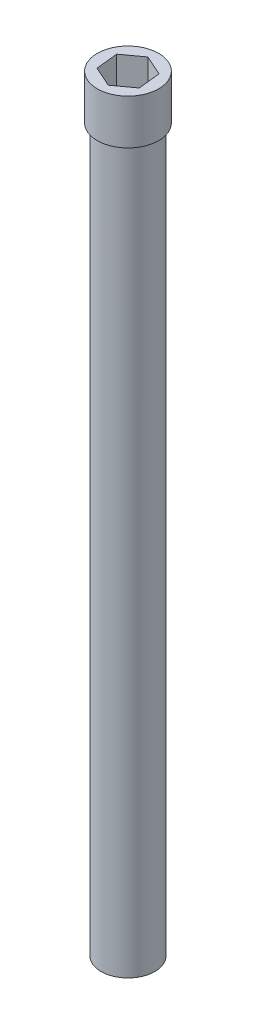
ISO-10303-21;
HEADER;
FILE_DESCRIPTION(('STEP AP214'),'2;1');
FILE_NAME('part.step','',(''),(''),'','','');
FILE_SCHEMA(('AUTOMOTIVE_DESIGN { 1 0 10303 214 1 1 1 1 }'));
ENDSEC;
DATA;
#1=APPLICATION_CONTEXT('core data for automotive mechanical design processes');
#2=APPLICATION_PROTOCOL_DEFINITION('international standard','automotive_design',2000,#1);
#3=PRODUCT_CONTEXT('',#1,'mechanical');
#4=PRODUCT('Part','Part','',(#3));
#5=PRODUCT_RELATED_PRODUCT_CATEGORY('part','',(#4));
#6=PRODUCT_DEFINITION_FORMATION('','',#4);
#7=PRODUCT_DEFINITION_CONTEXT('part definition',#1,'design');
#8=PRODUCT_DEFINITION('design','',#6,#7);
#9=PRODUCT_DEFINITION_SHAPE('','',#8);
#10=(LENGTH_UNIT() NAMED_UNIT(*) SI_UNIT(.MILLI.,.METRE.));
#11=(NAMED_UNIT(*) PLANE_ANGLE_UNIT() SI_UNIT($,.RADIAN.));
#12=(NAMED_UNIT(*) SI_UNIT($,.STERADIAN.) SOLID_ANGLE_UNIT());
#13=UNCERTAINTY_MEASURE_WITH_UNIT(LENGTH_MEASURE(1.E-05),#10,'distance_accuracy_value','');
#14=(GEOMETRIC_REPRESENTATION_CONTEXT(3) GLOBAL_UNCERTAINTY_ASSIGNED_CONTEXT((#13)) GLOBAL_UNIT_ASSIGNED_CONTEXT((#10,
#11,#12)) REPRESENTATION_CONTEXT('',''));
#15=CARTESIAN_POINT('',(0.,0.,0.));
#16=DIRECTION('',(0.,0.,1.));
#17=DIRECTION('',(1.,0.,0.));
#18=AXIS2_PLACEMENT_3D('',#15,#16,#17);
#19=CARTESIAN_POINT('',(0.,30.,0.));
#20=DIRECTION('',(0.,-1.,0.));
#21=DIRECTION('',(0.,0.,-1.));
#22=AXIS2_PLACEMENT_3D('',#19,#20,#21);
#23=CYLINDRICAL_SURFACE('',#22,3.);
#24=CARTESIAN_POINT('',(0.,30.,0.));
#25=DIRECTION('',(0.,1.,0.));
#26=DIRECTION('',(0.,0.,1.));
#27=AXIS2_PLACEMENT_3D('',#24,#25,#26);
#28=CIRCLE('',#27,3.);
#29=CARTESIAN_POINT('',(0.,30.,3.));
#30=VERTEX_POINT('',#29);
#31=EDGE_CURVE('E11',#30,#30,#28,.T.);
#32=ORIENTED_EDGE('',*,*,#31,.F.);
#33=EDGE_LOOP('',(#32));
#34=FACE_BOUND('',#33,.T.);
#35=CARTESIAN_POINT('',(0.,-50.3608413131586,0.));
#36=DIRECTION('',(0.,-1.,0.));
#37=DIRECTION('',(0.,0.,-1.));
#38=AXIS2_PLACEMENT_3D('',#35,#36,#37);
#39=CIRCLE('',#38,3.);
#40=CARTESIAN_POINT('',(0.,-50.3608413131586,-3.));
#41=VERTEX_POINT('',#40);
#42=EDGE_CURVE('E126',#41,#41,#39,.T.);
#43=ORIENTED_EDGE('',*,*,#42,.F.);
#44=EDGE_LOOP('',(#43));
#45=FACE_BOUND('',#44,.T.);
#46=ADVANCED_FACE('F37',(#34,#45),#23,.T.);
#47=CARTESIAN_POINT('',(0.,35.,0.));
#48=DIRECTION('',(0.,-1.,0.));
#49=DIRECTION('',(0.,0.,-1.));
#50=AXIS2_PLACEMENT_3D('',#47,#48,#49);
#51=CYLINDRICAL_SURFACE('',#50,3.42046218774851);
#52=CARTESIAN_POINT('',(0.,35.,0.));
#53=DIRECTION('',(0.,1.,0.));
#54=DIRECTION('',(0.,0.,1.));
#55=AXIS2_PLACEMENT_3D('',#52,#53,#54);
#56=CIRCLE('',#55,3.42046218774851);
#57=CARTESIAN_POINT('',(0.,35.,3.42046218774851));
#58=VERTEX_POINT('',#57);
#59=EDGE_CURVE('E44',#58,#58,#56,.T.);
#60=ORIENTED_EDGE('',*,*,#59,.F.);
#61=EDGE_LOOP('',(#60));
#62=FACE_BOUND('',#61,.T.);
#63=CARTESIAN_POINT('',(0.,30.,0.));
#64=DIRECTION('',(0.,1.,0.));
#65=DIRECTION('',(0.,0.,1.));
#66=AXIS2_PLACEMENT_3D('',#63,#64,#65);
#67=CIRCLE('',#66,3.42046218774851);
#68=CARTESIAN_POINT('',(0.,30.,3.42046218774851));
#69=VERTEX_POINT('',#68);
#70=EDGE_CURVE('E139',#69,#69,#67,.T.);
#71=ORIENTED_EDGE('',*,*,#70,.T.);
#72=EDGE_LOOP('',(#71));
#73=FACE_BOUND('',#72,.T.);
#74=ADVANCED_FACE('F149',(#62,#73),#51,.T.);
#75=CARTESIAN_POINT('',(0.,35.,0.));
#76=DIRECTION('',(0.,1.,0.));
#77=DIRECTION('',(0.,0.,1.));
#78=AXIS2_PLACEMENT_3D('',#75,#76,#77);
#79=PLANE('',#78);
#80=DIRECTION('',(-0.913544574829607,0.,-0.406738625900459));
#81=VECTOR('',#80,1.);
#82=CARTESIAN_POINT('',(2.00298550640401,35.,-1.45524751111598));
#83=LINE('',#82,#81);
#84=CARTESIAN_POINT('',(2.00298550640401,35.,-1.45524751111598));
#85=VERTEX_POINT('',#84);
#86=CARTESIAN_POINT('',(-0.258788560218509,35.,-2.46226008751591));
#87=VERTEX_POINT('',#86);
#88=EDGE_CURVE('E51',#85,#87,#83,.T.);
#89=ORIENTED_EDGE('',*,*,#88,.F.);
#90=DIRECTION('',(-0.104526304684631,0.,-0.994522122242123));
#91=VECTOR('',#90,1.);
#92=CARTESIAN_POINT('',(2.26177406662252,35.,1.00701257639993));
#93=LINE('',#92,#91);
#94=CARTESIAN_POINT('',(2.26177406662252,35.,1.00701257639993));
#95=VERTEX_POINT('',#94);
#96=EDGE_CURVE('E135',#95,#85,#93,.T.);
#97=ORIENTED_EDGE('',*,*,#96,.F.);
#98=DIRECTION('',(0.809018270144976,0.,-0.587783496341664));
#99=VECTOR('',#98,1.);
#100=CARTESIAN_POINT('',(0.258788560218506,35.,2.46226008751591));
#101=LINE('',#100,#99);
#102=CARTESIAN_POINT('',(0.258788560218506,35.,2.46226008751591));
#103=VERTEX_POINT('',#102);
#104=EDGE_CURVE('E133',#103,#95,#101,.T.);
#105=ORIENTED_EDGE('',*,*,#104,.F.);
#106=DIRECTION('',(0.913544574829607,0.,0.406738625900458));
#107=VECTOR('',#106,1.);
#108=CARTESIAN_POINT('',(-2.00298550640401,35.,1.45524751111598));
#109=LINE('',#108,#107);
#110=CARTESIAN_POINT('',(-2.00298550640401,35.,1.45524751111598));
#111=VERTEX_POINT('',#110);
#112=EDGE_CURVE('E99',#111,#103,#109,.T.);
#113=ORIENTED_EDGE('',*,*,#112,.F.);
#114=DIRECTION('',(0.104526304684631,0.,0.994522122242123));
#115=VECTOR('',#114,1.);
#116=CARTESIAN_POINT('',(-2.26177406662252,35.,-1.00701257639992));
#117=LINE('',#116,#115);
#118=CARTESIAN_POINT('',(-2.26177406662252,35.,-1.00701257639992));
#119=VERTEX_POINT('',#118);
#120=EDGE_CURVE('E129',#119,#111,#117,.T.);
#121=ORIENTED_EDGE('',*,*,#120,.F.);
#122=DIRECTION('',(-0.809018270144976,0.,0.587783496341665));
#123=VECTOR('',#122,1.);
#124=CARTESIAN_POINT('',(-0.258788560218509,35.,-2.46226008751591));
#125=LINE('',#124,#123);
#126=EDGE_CURVE('E125',#87,#119,#125,.T.);
#127=ORIENTED_EDGE('',*,*,#126,.F.);
#128=EDGE_LOOP('',(#89,#97,#105,#113,#121,#127));
#129=FACE_BOUND('',#128,.T.);
#130=ORIENTED_EDGE('',*,*,#59,.T.);
#131=EDGE_LOOP('',(#130));
#132=FACE_BOUND('',#131,.T.);
#133=ADVANCED_FACE('F154',(#129,#132),#79,.T.);
#134=CARTESIAN_POINT('',(0.,30.,0.));
#135=DIRECTION('',(0.,1.,0.));
#136=DIRECTION('',(0.,0.,1.));
#137=AXIS2_PLACEMENT_3D('',#134,#135,#136);
#138=PLANE('',#137);
#139=ORIENTED_EDGE('',*,*,#31,.T.);
#140=EDGE_LOOP('',(#139));
#141=FACE_BOUND('',#140,.T.);
#142=ORIENTED_EDGE('',*,*,#70,.F.);
#143=EDGE_LOOP('',(#142));
#144=FACE_BOUND('',#143,.T.);
#145=ADVANCED_FACE('F151',(#141,#144),#138,.F.);
#146=CARTESIAN_POINT('',(2.00298550640401,31.,-1.45524751111598));
#147=DIRECTION('',(0.406738625900459,0.,-0.913544574829607));
#148=DIRECTION('',(-0.913544574829607,0.,-0.406738625900459));
#149=AXIS2_PLACEMENT_3D('',#146,#147,#148);
#150=PLANE('',#149);
#151=ORIENTED_EDGE('',*,*,#88,.T.);
#152=DIRECTION('',(0.,1.,0.));
#153=VECTOR('',#152,1.);
#154=CARTESIAN_POINT('',(-0.258788560218509,31.,-2.46226008751591));
#155=LINE('',#154,#153);
#156=CARTESIAN_POINT('',(-0.258788560218509,31.,-2.46226008751591));
#157=VERTEX_POINT('',#156);
#158=EDGE_CURVE('E81',#157,#87,#155,.T.);
#159=ORIENTED_EDGE('',*,*,#158,.F.);
#160=DIRECTION('',(-0.913544574829607,0.,-0.406738625900459));
#161=VECTOR('',#160,1.);
#162=CARTESIAN_POINT('',(2.00298550640401,31.,-1.45524751111598));
#163=LINE('',#162,#161);
#164=CARTESIAN_POINT('',(2.00298550640401,31.,-1.45524751111598));
#165=VERTEX_POINT('',#164);
#166=EDGE_CURVE('E137',#165,#157,#163,.T.);
#167=ORIENTED_EDGE('',*,*,#166,.F.);
#168=DIRECTION('',(0.,1.,0.));
#169=VECTOR('',#168,1.);
#170=CARTESIAN_POINT('',(2.00298550640401,31.,-1.45524751111598));
#171=LINE('',#170,#169);
#172=EDGE_CURVE('E59',#165,#85,#171,.T.);
#173=ORIENTED_EDGE('',*,*,#172,.T.);
#174=EDGE_LOOP('',(#151,#159,#167,#173));
#175=FACE_BOUND('',#174,.T.);
#176=ADVANCED_FACE('F153',(#175),#150,.F.);
#177=CARTESIAN_POINT('',(2.26177406662252,31.,1.00701257639993));
#178=DIRECTION('',(0.994522122242123,0.,-0.104526304684631));
#179=DIRECTION('',(-0.104526304684631,0.,-0.994522122242123));
#180=AXIS2_PLACEMENT_3D('',#177,#178,#179);
#181=PLANE('',#180);
#182=ORIENTED_EDGE('',*,*,#96,.T.);
#183=ORIENTED_EDGE('',*,*,#172,.F.);
#184=DIRECTION('',(-0.104526304684631,0.,-0.994522122242123));
#185=VECTOR('',#184,1.);
#186=CARTESIAN_POINT('',(2.26177406662252,31.,1.00701257639993));
#187=LINE('',#186,#185);
#188=CARTESIAN_POINT('',(2.26177406662252,31.,1.00701257639993));
#189=VERTEX_POINT('',#188);
#190=EDGE_CURVE('E111',#189,#165,#187,.T.);
#191=ORIENTED_EDGE('',*,*,#190,.F.);
#192=DIRECTION('',(0.,1.,0.));
#193=VECTOR('',#192,1.);
#194=CARTESIAN_POINT('',(2.26177406662252,31.,1.00701257639993));
#195=LINE('',#194,#193);
#196=EDGE_CURVE('E103',#189,#95,#195,.T.);
#197=ORIENTED_EDGE('',*,*,#196,.T.);
#198=EDGE_LOOP('',(#182,#183,#191,#197));
#199=FACE_BOUND('',#198,.T.);
#200=ADVANCED_FACE('F161',(#199),#181,.F.);
#201=CARTESIAN_POINT('',(0.258788560218506,31.,2.46226008751591));
#202=DIRECTION('',(0.587783496341664,0.,0.809018270144976));
#203=DIRECTION('',(0.809018270144976,0.,-0.587783496341664));
#204=AXIS2_PLACEMENT_3D('',#201,#202,#203);
#205=PLANE('',#204);
#206=ORIENTED_EDGE('',*,*,#104,.T.);
#207=ORIENTED_EDGE('',*,*,#196,.F.);
#208=DIRECTION('',(0.809018270144976,0.,-0.587783496341664));
#209=VECTOR('',#208,1.);
#210=CARTESIAN_POINT('',(0.258788560218506,31.,2.46226008751591));
#211=LINE('',#210,#209);
#212=CARTESIAN_POINT('',(0.258788560218506,31.,2.46226008751591));
#213=VERTEX_POINT('',#212);
#214=EDGE_CURVE('E107',#213,#189,#211,.T.);
#215=ORIENTED_EDGE('',*,*,#214,.F.);
#216=DIRECTION('',(0.,1.,0.));
#217=VECTOR('',#216,1.);
#218=CARTESIAN_POINT('',(0.258788560218506,31.,2.46226008751591));
#219=LINE('',#218,#217);
#220=EDGE_CURVE('E92',#213,#103,#219,.T.);
#221=ORIENTED_EDGE('',*,*,#220,.T.);
#222=EDGE_LOOP('',(#206,#207,#215,#221));
#223=FACE_BOUND('',#222,.T.);
#224=ADVANCED_FACE('F108',(#223),#205,.F.);
#225=CARTESIAN_POINT('',(-2.00298550640401,31.,1.45524751111598));
#226=DIRECTION('',(-0.406738625900459,0.,0.913544574829607));
#227=DIRECTION('',(0.913544574829607,0.,0.406738625900459));
#228=AXIS2_PLACEMENT_3D('',#225,#226,#227);
#229=PLANE('',#228);
#230=ORIENTED_EDGE('',*,*,#112,.T.);
#231=ORIENTED_EDGE('',*,*,#220,.F.);
#232=DIRECTION('',(0.913544574829607,0.,0.406738625900458));
#233=VECTOR('',#232,1.);
#234=CARTESIAN_POINT('',(-2.00298550640401,31.,1.45524751111598));
#235=LINE('',#234,#233);
#236=CARTESIAN_POINT('',(-2.00298550640401,31.,1.45524751111598));
#237=VERTEX_POINT('',#236);
#238=EDGE_CURVE('E96',#237,#213,#235,.T.);
#239=ORIENTED_EDGE('',*,*,#238,.F.);
#240=DIRECTION('',(0.,1.,0.));
#241=VECTOR('',#240,1.);
#242=CARTESIAN_POINT('',(-2.00298550640401,31.,1.45524751111598));
#243=LINE('',#242,#241);
#244=EDGE_CURVE('E104',#237,#111,#243,.T.);
#245=ORIENTED_EDGE('',*,*,#244,.T.);
#246=EDGE_LOOP('',(#230,#231,#239,#245));
#247=FACE_BOUND('',#246,.T.);
#248=ADVANCED_FACE('F94',(#247),#229,.F.);
#249=CARTESIAN_POINT('',(-2.26177406662252,31.,-1.00701257639992));
#250=DIRECTION('',(-0.994522122242123,0.,0.104526304684631));
#251=DIRECTION('',(0.104526304684631,0.,0.994522122242123));
#252=AXIS2_PLACEMENT_3D('',#249,#250,#251);
#253=PLANE('',#252);
#254=ORIENTED_EDGE('',*,*,#120,.T.);
#255=ORIENTED_EDGE('',*,*,#244,.F.);
#256=DIRECTION('',(0.104526304684631,0.,0.994522122242123));
#257=VECTOR('',#256,1.);
#258=CARTESIAN_POINT('',(-2.26177406662252,31.,-1.00701257639992));
#259=LINE('',#258,#257);
#260=CARTESIAN_POINT('',(-2.26177406662252,31.,-1.00701257639992));
#261=VERTEX_POINT('',#260);
#262=EDGE_CURVE('E117',#261,#237,#259,.T.);
#263=ORIENTED_EDGE('',*,*,#262,.F.);
#264=DIRECTION('',(0.,1.,0.));
#265=VECTOR('',#264,1.);
#266=CARTESIAN_POINT('',(-2.26177406662252,31.,-1.00701257639992));
#267=LINE('',#266,#265);
#268=EDGE_CURVE('E142',#261,#119,#267,.T.);
#269=ORIENTED_EDGE('',*,*,#268,.T.);
#270=EDGE_LOOP('',(#254,#255,#263,#269));
#271=FACE_BOUND('',#270,.T.);
#272=ADVANCED_FACE('F185',(#271),#253,.F.);
#273=CARTESIAN_POINT('',(-0.258788560218509,31.,-2.46226008751591));
#274=DIRECTION('',(-0.587783496341665,0.,-0.809018270144976));
#275=DIRECTION('',(-0.809018270144976,0.,0.587783496341665));
#276=AXIS2_PLACEMENT_3D('',#273,#274,#275);
#277=PLANE('',#276);
#278=ORIENTED_EDGE('',*,*,#126,.T.);
#279=ORIENTED_EDGE('',*,*,#268,.F.);
#280=DIRECTION('',(-0.809018270144976,0.,0.587783496341665));
#281=VECTOR('',#280,1.);
#282=CARTESIAN_POINT('',(-0.258788560218509,31.,-2.46226008751591));
#283=LINE('',#282,#281);
#284=EDGE_CURVE('E119',#157,#261,#283,.T.);
#285=ORIENTED_EDGE('',*,*,#284,.F.);
#286=ORIENTED_EDGE('',*,*,#158,.T.);
#287=EDGE_LOOP('',(#278,#279,#285,#286));
#288=FACE_BOUND('',#287,.T.);
#289=ADVANCED_FACE('F181',(#288),#277,.F.);
#290=CARTESIAN_POINT('',(0.,31.,0.));
#291=DIRECTION('',(0.,1.,0.));
#292=DIRECTION('',(0.,0.,1.));
#293=AXIS2_PLACEMENT_3D('',#290,#291,#292);
#294=PLANE('',#293);
#295=ORIENTED_EDGE('',*,*,#166,.T.);
#296=ORIENTED_EDGE('',*,*,#284,.T.);
#297=ORIENTED_EDGE('',*,*,#262,.T.);
#298=ORIENTED_EDGE('',*,*,#238,.T.);
#299=ORIENTED_EDGE('',*,*,#214,.T.);
#300=ORIENTED_EDGE('',*,*,#190,.T.);
#301=EDGE_LOOP('',(#295,#296,#297,#298,#299,#300));
#302=FACE_BOUND('',#301,.T.);
#303=ADVANCED_FACE('F114',(#302),#294,.T.);
#304=CARTESIAN_POINT('',(0.,-50.3608413131586,0.));
#305=DIRECTION('',(0.,-1.,0.));
#306=DIRECTION('',(0.,0.,-1.));
#307=AXIS2_PLACEMENT_3D('',#304,#305,#306);
#308=PLANE('',#307);
#309=ORIENTED_EDGE('',*,*,#42,.T.);
#310=EDGE_LOOP('',(#309));
#311=FACE_BOUND('',#310,.T.);
#312=ADVANCED_FACE('F204',(#311),#308,.T.);
#313=CLOSED_SHELL('',(#46,#74,#133,#145,#176,#200,#224,#248,#272,#289,#303,#312));
#314=MANIFOLD_SOLID_BREP('B2',#313);
#315=ADVANCED_BREP_SHAPE_REPRESENTATION('',(#18,#314),#14);
#316=SHAPE_DEFINITION_REPRESENTATION(#9,#315);
ENDSEC;
END-ISO-10303-21;
